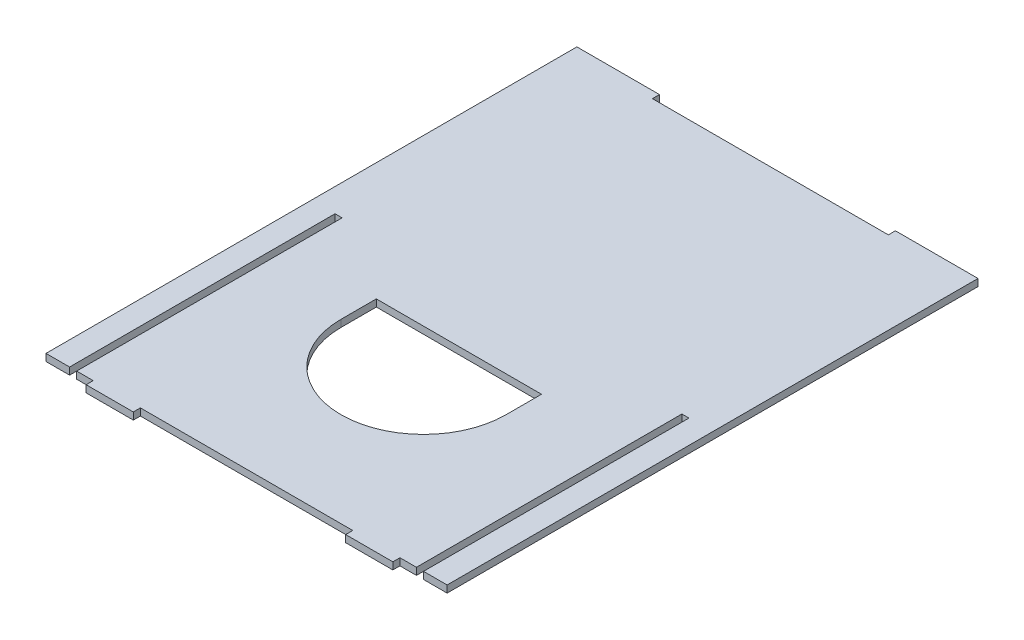
ISO-10303-21;
HEADER;
FILE_DESCRIPTION(('STEP AP214'),'2;1');
FILE_NAME('part.step','',(''),(''),'','','');
FILE_SCHEMA(('AUTOMOTIVE_DESIGN { 1 0 10303 214 1 1 1 1 }'));
ENDSEC;
DATA;
#1=APPLICATION_CONTEXT('core data for automotive mechanical design processes');
#2=APPLICATION_PROTOCOL_DEFINITION('international standard','automotive_design',2000,#1);
#3=PRODUCT_CONTEXT('',#1,'mechanical');
#4=PRODUCT('Part','Part','',(#3));
#5=PRODUCT_RELATED_PRODUCT_CATEGORY('part','',(#4));
#6=PRODUCT_DEFINITION_FORMATION('','',#4);
#7=PRODUCT_DEFINITION_CONTEXT('part definition',#1,'design');
#8=PRODUCT_DEFINITION('design','',#6,#7);
#9=PRODUCT_DEFINITION_SHAPE('','',#8);
#10=(LENGTH_UNIT() NAMED_UNIT(*) SI_UNIT(.MILLI.,.METRE.));
#11=(NAMED_UNIT(*) PLANE_ANGLE_UNIT() SI_UNIT($,.RADIAN.));
#12=(NAMED_UNIT(*) SI_UNIT($,.STERADIAN.) SOLID_ANGLE_UNIT());
#13=UNCERTAINTY_MEASURE_WITH_UNIT(LENGTH_MEASURE(1.E-05),#10,'distance_accuracy_value','');
#14=(GEOMETRIC_REPRESENTATION_CONTEXT(3) GLOBAL_UNCERTAINTY_ASSIGNED_CONTEXT((#13)) GLOBAL_UNIT_ASSIGNED_CONTEXT((#10,
#11,#12)) REPRESENTATION_CONTEXT('',''));
#15=CARTESIAN_POINT('',(0.,0.,0.));
#16=DIRECTION('',(0.,0.,1.));
#17=DIRECTION('',(1.,0.,0.));
#18=AXIS2_PLACEMENT_3D('',#15,#16,#17);
#19=CARTESIAN_POINT('',(0.,6.,-450.));
#20=DIRECTION('',(0.,0.,1.));
#21=DIRECTION('',(1.,0.,0.));
#22=AXIS2_PLACEMENT_3D('',#19,#20,#21);
#23=PLANE('',#22);
#24=DIRECTION('',(-1.,0.,0.));
#25=VECTOR('',#24,1.);
#26=CARTESIAN_POINT('',(0.,6.,-450.));
#27=LINE('',#26,#25);
#28=CARTESIAN_POINT('',(70.,6.,-450.));
#29=VERTEX_POINT('',#28);
#30=CARTESIAN_POINT('',(0.,6.,-450.));
#31=VERTEX_POINT('',#30);
#32=EDGE_CURVE('E365',#29,#31,#27,.T.);
#33=ORIENTED_EDGE('',*,*,#32,.F.);
#34=DIRECTION('',(0.,1.,0.));
#35=VECTOR('',#34,1.);
#36=CARTESIAN_POINT('',(70.,0.,-450.));
#37=LINE('',#36,#35);
#38=CARTESIAN_POINT('',(70.,0.,-450.));
#39=VERTEX_POINT('',#38);
#40=EDGE_CURVE('E272',#39,#29,#37,.T.);
#41=ORIENTED_EDGE('',*,*,#40,.F.);
#42=DIRECTION('',(-1.,0.,0.));
#43=VECTOR('',#42,1.);
#44=CARTESIAN_POINT('',(0.,0.,-450.));
#45=LINE('',#44,#43);
#46=CARTESIAN_POINT('',(0.,0.,-450.));
#47=VERTEX_POINT('',#46);
#48=EDGE_CURVE('E395',#39,#47,#45,.T.);
#49=ORIENTED_EDGE('',*,*,#48,.T.);
#50=DIRECTION('',(0.,-1.,0.));
#51=VECTOR('',#50,1.);
#52=CARTESIAN_POINT('',(0.,6.,-450.));
#53=LINE('',#52,#51);
#54=EDGE_CURVE('E403',#31,#47,#53,.T.);
#55=ORIENTED_EDGE('',*,*,#54,.F.);
#56=EDGE_LOOP('',(#33,#41,#49,#55));
#57=FACE_BOUND('',#56,.T.);
#58=ADVANCED_FACE('F41',(#57),#23,.F.);
#59=CARTESIAN_POINT('',(300.,6.,-2.10463319099841E-13));
#60=DIRECTION('',(0.,0.,-1.));
#61=DIRECTION('',(-1.,0.,0.));
#62=AXIS2_PLACEMENT_3D('',#59,#60,#61);
#63=PLANE('',#62);
#64=DIRECTION('',(1.,0.,0.));
#65=VECTOR('',#64,1.);
#66=CARTESIAN_POINT('',(300.,0.,-2.10463319099841E-13));
#67=LINE('',#66,#65);
#68=CARTESIAN_POINT('',(300.,0.,-2.10463319099841E-13));
#69=VERTEX_POINT('',#68);
#70=CARTESIAN_POINT('',(314.,0.,-3.31505656259168E-13));
#71=VERTEX_POINT('',#70);
#72=EDGE_CURVE('E390',#69,#71,#67,.T.);
#73=ORIENTED_EDGE('',*,*,#72,.T.);
#74=DIRECTION('',(0.,1.,0.));
#75=VECTOR('',#74,1.);
#76=CARTESIAN_POINT('',(314.,0.,-3.31505656259168E-13));
#77=LINE('',#76,#75);
#78=CARTESIAN_POINT('',(314.,6.,-3.31505656259168E-13));
#79=VERTEX_POINT('',#78);
#80=EDGE_CURVE('E299',#71,#79,#77,.T.);
#81=ORIENTED_EDGE('',*,*,#80,.T.);
#82=DIRECTION('',(1.,0.,0.));
#83=VECTOR('',#82,1.);
#84=CARTESIAN_POINT('',(300.,6.,-2.10463319099841E-13));
#85=LINE('',#84,#83);
#86=CARTESIAN_POINT('',(300.,6.,-2.10463319099841E-13));
#87=VERTEX_POINT('',#86);
#88=EDGE_CURVE('E360',#87,#79,#85,.T.);
#89=ORIENTED_EDGE('',*,*,#88,.F.);
#90=DIRECTION('',(0.,-1.,0.));
#91=VECTOR('',#90,1.);
#92=CARTESIAN_POINT('',(300.,6.,-2.10463319099841E-13));
#93=LINE('',#92,#91);
#94=EDGE_CURVE('E412',#87,#69,#93,.T.);
#95=ORIENTED_EDGE('',*,*,#94,.T.);
#96=EDGE_LOOP('',(#73,#81,#89,#95));
#97=FACE_BOUND('',#96,.T.);
#98=ADVANCED_FACE('F523',(#97),#63,.F.);
#99=CARTESIAN_POINT('',(40.,6.,0.));
#100=DIRECTION('',(0.,0.,-1.));
#101=DIRECTION('',(-1.,0.,0.));
#102=AXIS2_PLACEMENT_3D('',#99,#100,#101);
#103=PLANE('',#102);
#104=DIRECTION('',(1.,0.,0.));
#105=VECTOR('',#104,1.);
#106=CARTESIAN_POINT('',(40.,0.,0.));
#107=LINE('',#106,#105);
#108=CARTESIAN_POINT('',(0.,0.,0.));
#109=VERTEX_POINT('',#108);
#110=CARTESIAN_POINT('',(20.,0.,0.));
#111=VERTEX_POINT('',#110);
#112=EDGE_CURVE('E372',#109,#111,#107,.T.);
#113=ORIENTED_EDGE('',*,*,#112,.T.);
#114=DIRECTION('',(0.,1.,0.));
#115=VECTOR('',#114,1.);
#116=CARTESIAN_POINT('',(20.,0.,0.));
#117=LINE('',#116,#115);
#118=CARTESIAN_POINT('',(20.,6.,0.));
#119=VERTEX_POINT('',#118);
#120=EDGE_CURVE('E325',#111,#119,#117,.T.);
#121=ORIENTED_EDGE('',*,*,#120,.T.);
#122=DIRECTION('',(1.,0.,0.));
#123=VECTOR('',#122,1.);
#124=CARTESIAN_POINT('',(40.,6.,0.));
#125=LINE('',#124,#123);
#126=CARTESIAN_POINT('',(0.,6.,0.));
#127=VERTEX_POINT('',#126);
#128=EDGE_CURVE('E341',#127,#119,#125,.T.);
#129=ORIENTED_EDGE('',*,*,#128,.F.);
#130=DIRECTION('',(0.,-1.,0.));
#131=VECTOR('',#130,1.);
#132=CARTESIAN_POINT('',(0.,6.,0.));
#133=LINE('',#132,#131);
#134=EDGE_CURVE('E371',#127,#109,#133,.T.);
#135=ORIENTED_EDGE('',*,*,#134,.T.);
#136=EDGE_LOOP('',(#113,#121,#129,#135));
#137=FACE_BOUND('',#136,.T.);
#138=ADVANCED_FACE('F475',(#137),#103,.F.);
#139=CARTESIAN_POINT('',(26.,6.,0.));
#140=VERTEX_POINT('',#139);
#141=CARTESIAN_POINT('',(40.,6.,0.));
#142=VERTEX_POINT('',#141);
#143=EDGE_CURVE('E345',#140,#142,#125,.T.);
#144=ORIENTED_EDGE('',*,*,#143,.F.);
#145=DIRECTION('',(0.,1.,0.));
#146=VECTOR('',#145,1.);
#147=CARTESIAN_POINT('',(26.,0.,0.));
#148=LINE('',#147,#146);
#149=CARTESIAN_POINT('',(26.,0.,0.));
#150=VERTEX_POINT('',#149);
#151=EDGE_CURVE('E337',#150,#140,#148,.T.);
#152=ORIENTED_EDGE('',*,*,#151,.F.);
#153=CARTESIAN_POINT('',(40.,0.,0.));
#154=VERTEX_POINT('',#153);
#155=EDGE_CURVE('E334',#150,#154,#107,.T.);
#156=ORIENTED_EDGE('',*,*,#155,.T.);
#157=DIRECTION('',(0.,-1.,0.));
#158=VECTOR('',#157,1.);
#159=CARTESIAN_POINT('',(40.,6.,0.));
#160=LINE('',#159,#158);
#161=EDGE_CURVE('E11',#142,#154,#160,.T.);
#162=ORIENTED_EDGE('',*,*,#161,.F.);
#163=EDGE_LOOP('',(#144,#152,#156,#162));
#164=FACE_BOUND('',#163,.T.);
#165=ADVANCED_FACE('F43',(#164),#103,.F.);
#166=CARTESIAN_POINT('',(40.,6.,0.));
#167=DIRECTION('',(1.,0.,0.));
#168=DIRECTION('',(0.,0.,-1.));
#169=AXIS2_PLACEMENT_3D('',#166,#167,#168);
#170=PLANE('',#169);
#171=DIRECTION('',(0.,0.,1.));
#172=VECTOR('',#171,1.);
#173=CARTESIAN_POINT('',(40.,0.,0.));
#174=LINE('',#173,#172);
#175=CARTESIAN_POINT('',(40.,0.,6.00000000000003));
#176=VERTEX_POINT('',#175);
#177=EDGE_CURVE('E375',#154,#176,#174,.T.);
#178=ORIENTED_EDGE('',*,*,#177,.T.);
#179=DIRECTION('',(0.,-1.,0.));
#180=VECTOR('',#179,1.);
#181=CARTESIAN_POINT('',(40.,6.,6.00000000000003));
#182=LINE('',#181,#180);
#183=CARTESIAN_POINT('',(40.,6.,6.00000000000003));
#184=VERTEX_POINT('',#183);
#185=EDGE_CURVE('E49',#184,#176,#182,.T.);
#186=ORIENTED_EDGE('',*,*,#185,.F.);
#187=DIRECTION('',(0.,0.,1.));
#188=VECTOR('',#187,1.);
#189=CARTESIAN_POINT('',(40.,6.,0.));
#190=LINE('',#189,#188);
#191=EDGE_CURVE('E344',#142,#184,#190,.T.);
#192=ORIENTED_EDGE('',*,*,#191,.F.);
#193=ORIENTED_EDGE('',*,*,#161,.T.);
#194=EDGE_LOOP('',(#178,#186,#192,#193));
#195=FACE_BOUND('',#194,.T.);
#196=ADVANCED_FACE('F459',(#195),#170,.F.);
#197=CARTESIAN_POINT('',(40.,6.,6.00000000000003));
#198=DIRECTION('',(0.,0.,-1.));
#199=DIRECTION('',(-1.,0.,0.));
#200=AXIS2_PLACEMENT_3D('',#197,#198,#199);
#201=PLANE('',#200);
#202=DIRECTION('',(1.,0.,0.));
#203=VECTOR('',#202,1.);
#204=CARTESIAN_POINT('',(40.,0.,6.00000000000003));
#205=LINE('',#204,#203);
#206=CARTESIAN_POINT('',(80.,0.,5.99999999999993));
#207=VERTEX_POINT('',#206);
#208=EDGE_CURVE('E377',#176,#207,#205,.T.);
#209=ORIENTED_EDGE('',*,*,#208,.T.);
#210=DIRECTION('',(0.,-1.,0.));
#211=VECTOR('',#210,1.);
#212=CARTESIAN_POINT('',(80.,6.,5.99999999999993));
#213=LINE('',#212,#211);
#214=CARTESIAN_POINT('',(80.,6.,5.99999999999993));
#215=VERTEX_POINT('',#214);
#216=EDGE_CURVE('E427',#215,#207,#213,.T.);
#217=ORIENTED_EDGE('',*,*,#216,.F.);
#218=DIRECTION('',(1.,0.,0.));
#219=VECTOR('',#218,1.);
#220=CARTESIAN_POINT('',(40.,6.,6.00000000000003));
#221=LINE('',#220,#219);
#222=EDGE_CURVE('E347',#184,#215,#221,.T.);
#223=ORIENTED_EDGE('',*,*,#222,.F.);
#224=ORIENTED_EDGE('',*,*,#185,.T.);
#225=EDGE_LOOP('',(#209,#217,#223,#224));
#226=FACE_BOUND('',#225,.T.);
#227=ADVANCED_FACE('F434',(#226),#201,.F.);
#228=CARTESIAN_POINT('',(80.,6.,5.99999999999993));
#229=DIRECTION('',(-1.,0.,0.));
#230=DIRECTION('',(0.,0.,1.));
#231=AXIS2_PLACEMENT_3D('',#228,#229,#230);
#232=PLANE('',#231);
#233=DIRECTION('',(0.,0.,-1.));
#234=VECTOR('',#233,1.);
#235=CARTESIAN_POINT('',(80.,0.,5.99999999999993));
#236=LINE('',#235,#234);
#237=CARTESIAN_POINT('',(80.,0.,0.));
#238=VERTEX_POINT('',#237);
#239=EDGE_CURVE('E379',#207,#238,#236,.T.);
#240=ORIENTED_EDGE('',*,*,#239,.T.);
#241=DIRECTION('',(0.,-1.,0.));
#242=VECTOR('',#241,1.);
#243=CARTESIAN_POINT('',(80.,6.,0.));
#244=LINE('',#243,#242);
#245=CARTESIAN_POINT('',(80.,6.,0.));
#246=VERTEX_POINT('',#245);
#247=EDGE_CURVE('E424',#246,#238,#244,.T.);
#248=ORIENTED_EDGE('',*,*,#247,.F.);
#249=DIRECTION('',(0.,0.,-1.));
#250=VECTOR('',#249,1.);
#251=CARTESIAN_POINT('',(80.,6.,5.99999999999993));
#252=LINE('',#251,#250);
#253=EDGE_CURVE('E349',#215,#246,#252,.T.);
#254=ORIENTED_EDGE('',*,*,#253,.F.);
#255=ORIENTED_EDGE('',*,*,#216,.T.);
#256=EDGE_LOOP('',(#240,#248,#254,#255));
#257=FACE_BOUND('',#256,.T.);
#258=ADVANCED_FACE('F445',(#257),#232,.F.);
#259=CARTESIAN_POINT('',(80.,6.,0.));
#260=DIRECTION('',(0.,0.,-1.));
#261=DIRECTION('',(-1.,0.,0.));
#262=AXIS2_PLACEMENT_3D('',#259,#260,#261);
#263=PLANE('',#262);
#264=DIRECTION('',(1.,0.,0.));
#265=VECTOR('',#264,1.);
#266=CARTESIAN_POINT('',(80.,0.,0.));
#267=LINE('',#266,#265);
#268=CARTESIAN_POINT('',(260.,0.,-1.85615411929518E-13));
#269=VERTEX_POINT('',#268);
#270=EDGE_CURVE('E381',#238,#269,#267,.T.);
#271=ORIENTED_EDGE('',*,*,#270,.T.);
#272=DIRECTION('',(0.,-1.,0.));
#273=VECTOR('',#272,1.);
#274=CARTESIAN_POINT('',(260.,6.,-1.85615411929518E-13));
#275=LINE('',#274,#273);
#276=CARTESIAN_POINT('',(260.,6.,-1.85615411929518E-13));
#277=VERTEX_POINT('',#276);
#278=EDGE_CURVE('E421',#277,#269,#275,.T.);
#279=ORIENTED_EDGE('',*,*,#278,.F.);
#280=DIRECTION('',(1.,0.,0.));
#281=VECTOR('',#280,1.);
#282=CARTESIAN_POINT('',(80.,6.,0.));
#283=LINE('',#282,#281);
#284=EDGE_CURVE('E351',#246,#277,#283,.T.);
#285=ORIENTED_EDGE('',*,*,#284,.F.);
#286=ORIENTED_EDGE('',*,*,#247,.T.);
#287=EDGE_LOOP('',(#271,#279,#285,#286));
#288=FACE_BOUND('',#287,.T.);
#289=ADVANCED_FACE('F449',(#288),#263,.F.);
#290=CARTESIAN_POINT('',(260.,6.,5.99999999999979));
#291=DIRECTION('',(1.,0.,0.));
#292=DIRECTION('',(0.,0.,-1.));
#293=AXIS2_PLACEMENT_3D('',#290,#291,#292);
#294=PLANE('',#293);
#295=DIRECTION('',(0.,0.,1.));
#296=VECTOR('',#295,1.);
#297=CARTESIAN_POINT('',(260.,0.,5.99999999999979));
#298=LINE('',#297,#296);
#299=CARTESIAN_POINT('',(260.,0.,5.99999999999979));
#300=VERTEX_POINT('',#299);
#301=EDGE_CURVE('E383',#269,#300,#298,.T.);
#302=ORIENTED_EDGE('',*,*,#301,.T.);
#303=DIRECTION('',(0.,-1.,0.));
#304=VECTOR('',#303,1.);
#305=CARTESIAN_POINT('',(260.,6.,5.99999999999979));
#306=LINE('',#305,#304);
#307=CARTESIAN_POINT('',(260.,6.,5.99999999999979));
#308=VERTEX_POINT('',#307);
#309=EDGE_CURVE('E418',#308,#300,#306,.T.);
#310=ORIENTED_EDGE('',*,*,#309,.F.);
#311=DIRECTION('',(0.,0.,1.));
#312=VECTOR('',#311,1.);
#313=CARTESIAN_POINT('',(260.,6.,5.99999999999979));
#314=LINE('',#313,#312);
#315=EDGE_CURVE('E353',#277,#308,#314,.T.);
#316=ORIENTED_EDGE('',*,*,#315,.F.);
#317=ORIENTED_EDGE('',*,*,#278,.T.);
#318=EDGE_LOOP('',(#302,#310,#316,#317));
#319=FACE_BOUND('',#318,.T.);
#320=ADVANCED_FACE('F535',(#319),#294,.F.);
#321=CARTESIAN_POINT('',(300.,6.,5.99999999999979));
#322=DIRECTION('',(0.,0.,-1.));
#323=DIRECTION('',(-1.,0.,0.));
#324=AXIS2_PLACEMENT_3D('',#321,#322,#323);
#325=PLANE('',#324);
#326=DIRECTION('',(1.,0.,0.));
#327=VECTOR('',#326,1.);
#328=CARTESIAN_POINT('',(300.,0.,5.99999999999979));
#329=LINE('',#328,#327);
#330=CARTESIAN_POINT('',(300.,0.,5.99999999999979));
#331=VERTEX_POINT('',#330);
#332=EDGE_CURVE('E385',#300,#331,#329,.T.);
#333=ORIENTED_EDGE('',*,*,#332,.T.);
#334=DIRECTION('',(0.,-1.,0.));
#335=VECTOR('',#334,1.);
#336=CARTESIAN_POINT('',(300.,6.,5.99999999999979));
#337=LINE('',#336,#335);
#338=CARTESIAN_POINT('',(300.,6.,5.99999999999979));
#339=VERTEX_POINT('',#338);
#340=EDGE_CURVE('E415',#339,#331,#337,.T.);
#341=ORIENTED_EDGE('',*,*,#340,.F.);
#342=DIRECTION('',(1.,0.,0.));
#343=VECTOR('',#342,1.);
#344=CARTESIAN_POINT('',(300.,6.,5.99999999999979));
#345=LINE('',#344,#343);
#346=EDGE_CURVE('E355',#308,#339,#345,.T.);
#347=ORIENTED_EDGE('',*,*,#346,.F.);
#348=ORIENTED_EDGE('',*,*,#309,.T.);
#349=EDGE_LOOP('',(#333,#341,#347,#348));
#350=FACE_BOUND('',#349,.T.);
#351=ADVANCED_FACE('F532',(#350),#325,.F.);
#352=CARTESIAN_POINT('',(300.,6.,-2.10463319099841E-13));
#353=DIRECTION('',(-1.,0.,0.));
#354=DIRECTION('',(0.,0.,1.));
#355=AXIS2_PLACEMENT_3D('',#352,#353,#354);
#356=PLANE('',#355);
#357=DIRECTION('',(0.,0.,-1.));
#358=VECTOR('',#357,1.);
#359=CARTESIAN_POINT('',(300.,0.,-2.10463319099841E-13));
#360=LINE('',#359,#358);
#361=EDGE_CURVE('E387',#331,#69,#360,.T.);
#362=ORIENTED_EDGE('',*,*,#361,.T.);
#363=ORIENTED_EDGE('',*,*,#94,.F.);
#364=DIRECTION('',(0.,0.,-1.));
#365=VECTOR('',#364,1.);
#366=CARTESIAN_POINT('',(300.,6.,-2.10463319099841E-13));
#367=LINE('',#366,#365);
#368=EDGE_CURVE('E357',#339,#87,#367,.T.);
#369=ORIENTED_EDGE('',*,*,#368,.F.);
#370=ORIENTED_EDGE('',*,*,#340,.T.);
#371=EDGE_LOOP('',(#362,#363,#369,#370));
#372=FACE_BOUND('',#371,.T.);
#373=ADVANCED_FACE('F528',(#372),#356,.F.);
#374=CARTESIAN_POINT('',(320.,6.,-3.31505656259168E-13));
#375=VERTEX_POINT('',#374);
#376=CARTESIAN_POINT('',(340.,6.,0.));
#377=VERTEX_POINT('',#376);
#378=EDGE_CURVE('E359',#375,#377,#85,.T.);
#379=ORIENTED_EDGE('',*,*,#378,.F.);
#380=DIRECTION('',(0.,1.,0.));
#381=VECTOR('',#380,1.);
#382=CARTESIAN_POINT('',(320.,0.,-3.31505656259168E-13));
#383=LINE('',#382,#381);
#384=CARTESIAN_POINT('',(320.,0.,-3.31505656259168E-13));
#385=VERTEX_POINT('',#384);
#386=EDGE_CURVE('E311',#385,#375,#383,.T.);
#387=ORIENTED_EDGE('',*,*,#386,.F.);
#388=CARTESIAN_POINT('',(340.,0.,0.));
#389=VERTEX_POINT('',#388);
#390=EDGE_CURVE('E389',#385,#389,#67,.T.);
#391=ORIENTED_EDGE('',*,*,#390,.T.);
#392=DIRECTION('',(0.,-1.,0.));
#393=VECTOR('',#392,1.);
#394=CARTESIAN_POINT('',(340.,6.,0.));
#395=LINE('',#394,#393);
#396=EDGE_CURVE('E409',#377,#389,#395,.T.);
#397=ORIENTED_EDGE('',*,*,#396,.F.);
#398=EDGE_LOOP('',(#379,#387,#391,#397));
#399=FACE_BOUND('',#398,.T.);
#400=ADVANCED_FACE('F509',(#399),#63,.F.);
#401=CARTESIAN_POINT('',(340.,6.,0.));
#402=DIRECTION('',(-1.,0.,0.));
#403=DIRECTION('',(0.,0.,1.));
#404=AXIS2_PLACEMENT_3D('',#401,#402,#403);
#405=PLANE('',#404);
#406=DIRECTION('',(0.,0.,-1.));
#407=VECTOR('',#406,1.);
#408=CARTESIAN_POINT('',(340.,0.,0.));
#409=LINE('',#408,#407);
#410=CARTESIAN_POINT('',(340.,0.,-450.));
#411=VERTEX_POINT('',#410);
#412=EDGE_CURVE('E393',#389,#411,#409,.T.);
#413=ORIENTED_EDGE('',*,*,#412,.T.);
#414=DIRECTION('',(0.,-1.,0.));
#415=VECTOR('',#414,1.);
#416=CARTESIAN_POINT('',(340.,6.,-450.));
#417=LINE('',#416,#415);
#418=CARTESIAN_POINT('',(340.,6.,-450.));
#419=VERTEX_POINT('',#418);
#420=EDGE_CURVE('E406',#419,#411,#417,.T.);
#421=ORIENTED_EDGE('',*,*,#420,.F.);
#422=DIRECTION('',(0.,0.,-1.));
#423=VECTOR('',#422,1.);
#424=CARTESIAN_POINT('',(340.,6.,0.));
#425=LINE('',#424,#423);
#426=EDGE_CURVE('E363',#377,#419,#425,.T.);
#427=ORIENTED_EDGE('',*,*,#426,.F.);
#428=ORIENTED_EDGE('',*,*,#396,.T.);
#429=EDGE_LOOP('',(#413,#421,#427,#428));
#430=FACE_BOUND('',#429,.T.);
#431=ADVANCED_FACE('F503',(#430),#405,.F.);
#432=CARTESIAN_POINT('',(270.,0.,-450.));
#433=VERTEX_POINT('',#432);
#434=EDGE_CURVE('E396',#411,#433,#45,.T.);
#435=ORIENTED_EDGE('',*,*,#434,.T.);
#436=DIRECTION('',(0.,1.,0.));
#437=VECTOR('',#436,1.);
#438=CARTESIAN_POINT('',(270.,0.,-450.));
#439=LINE('',#438,#437);
#440=CARTESIAN_POINT('',(270.,6.,-450.));
#441=VERTEX_POINT('',#440);
#442=EDGE_CURVE('E269',#433,#441,#439,.T.);
#443=ORIENTED_EDGE('',*,*,#442,.T.);
#444=EDGE_CURVE('E366',#419,#441,#27,.T.);
#445=ORIENTED_EDGE('',*,*,#444,.F.);
#446=ORIENTED_EDGE('',*,*,#420,.T.);
#447=EDGE_LOOP('',(#435,#443,#445,#446));
#448=FACE_BOUND('',#447,.T.);
#449=ADVANCED_FACE('F498',(#448),#23,.F.);
#450=CARTESIAN_POINT('',(0.,6.,0.));
#451=DIRECTION('',(1.,0.,0.));
#452=DIRECTION('',(0.,0.,-1.));
#453=AXIS2_PLACEMENT_3D('',#450,#451,#452);
#454=PLANE('',#453);
#455=DIRECTION('',(0.,0.,1.));
#456=VECTOR('',#455,1.);
#457=CARTESIAN_POINT('',(0.,0.,0.));
#458=LINE('',#457,#456);
#459=EDGE_CURVE('E399',#47,#109,#458,.T.);
#460=ORIENTED_EDGE('',*,*,#459,.T.);
#461=ORIENTED_EDGE('',*,*,#134,.F.);
#462=DIRECTION('',(0.,0.,1.));
#463=VECTOR('',#462,1.);
#464=CARTESIAN_POINT('',(0.,6.,0.));
#465=LINE('',#464,#463);
#466=EDGE_CURVE('E369',#31,#127,#465,.T.);
#467=ORIENTED_EDGE('',*,*,#466,.F.);
#468=ORIENTED_EDGE('',*,*,#54,.T.);
#469=EDGE_LOOP('',(#460,#461,#467,#468));
#470=FACE_BOUND('',#469,.T.);
#471=ADVANCED_FACE('F480',(#470),#454,.F.);
#472=CARTESIAN_POINT('',(0.,6.,0.));
#473=DIRECTION('',(0.,-1.,0.));
#474=DIRECTION('',(0.,0.,-1.));
#475=AXIS2_PLACEMENT_3D('',#472,#473,#474);
#476=PLANE('',#475);
#477=DIRECTION('',(0.,0.,1.));
#478=VECTOR('',#477,1.);
#479=CARTESIAN_POINT('',(100.,6.,-150.));
#480=LINE('',#479,#478);
#481=CARTESIAN_POINT('',(100.,6.,-180.));
#482=VERTEX_POINT('',#481);
#483=CARTESIAN_POINT('',(100.,6.,-150.));
#484=VERTEX_POINT('',#483);
#485=EDGE_CURVE('E253',#482,#484,#480,.T.);
#486=ORIENTED_EDGE('',*,*,#485,.F.);
#487=DIRECTION('',(-1.,0.,0.));
#488=VECTOR('',#487,1.);
#489=CARTESIAN_POINT('',(100.,6.,-180.));
#490=LINE('',#489,#488);
#491=CARTESIAN_POINT('',(240.,6.,-180.));
#492=VERTEX_POINT('',#491);
#493=EDGE_CURVE('E56',#492,#482,#490,.T.);
#494=ORIENTED_EDGE('',*,*,#493,.F.);
#495=DIRECTION('',(0.,0.,-1.));
#496=VECTOR('',#495,1.);
#497=CARTESIAN_POINT('',(240.,6.,-150.));
#498=LINE('',#497,#496);
#499=CARTESIAN_POINT('',(240.,6.,-150.));
#500=VERTEX_POINT('',#499);
#501=EDGE_CURVE('E244',#500,#492,#498,.T.);
#502=ORIENTED_EDGE('',*,*,#501,.F.);
#503=CARTESIAN_POINT('',(170.,6.,-150.));
#504=DIRECTION('',(0.,1.,0.));
#505=DIRECTION('',(0.,0.,1.));
#506=AXIS2_PLACEMENT_3D('',#503,#504,#505);
#507=CIRCLE('',#506,70.);
#508=EDGE_CURVE('E247',#484,#500,#507,.T.);
#509=ORIENTED_EDGE('',*,*,#508,.F.);
#510=EDGE_LOOP('',(#486,#494,#502,#509));
#511=FACE_BOUND('',#510,.T.);
#512=DIRECTION('',(1.,0.,0.));
#513=VECTOR('',#512,1.);
#514=CARTESIAN_POINT('',(70.,6.,-444.));
#515=LINE('',#514,#513);
#516=CARTESIAN_POINT('',(70.,6.,-444.));
#517=VERTEX_POINT('',#516);
#518=CARTESIAN_POINT('',(270.,6.,-444.));
#519=VERTEX_POINT('',#518);
#520=EDGE_CURVE('E276',#517,#519,#515,.T.);
#521=ORIENTED_EDGE('',*,*,#520,.F.);
#522=DIRECTION('',(0.,0.,1.));
#523=VECTOR('',#522,1.);
#524=CARTESIAN_POINT('',(70.,6.,-450.));
#525=LINE('',#524,#523);
#526=EDGE_CURVE('E254',#29,#517,#525,.T.);
#527=ORIENTED_EDGE('',*,*,#526,.F.);
#528=ORIENTED_EDGE('',*,*,#32,.T.);
#529=ORIENTED_EDGE('',*,*,#466,.T.);
#530=ORIENTED_EDGE('',*,*,#128,.T.);
#531=DIRECTION('',(0.,0.,1.));
#532=VECTOR('',#531,1.);
#533=CARTESIAN_POINT('',(20.,6.,0.));
#534=LINE('',#533,#532);
#535=CARTESIAN_POINT('',(20.,6.,-225.));
#536=VERTEX_POINT('',#535);
#537=EDGE_CURVE('E308',#536,#119,#534,.T.);
#538=ORIENTED_EDGE('',*,*,#537,.F.);
#539=DIRECTION('',(-1.,0.,0.));
#540=VECTOR('',#539,1.);
#541=CARTESIAN_POINT('',(20.,6.,-225.));
#542=LINE('',#541,#540);
#543=CARTESIAN_POINT('',(26.,6.,-225.));
#544=VERTEX_POINT('',#543);
#545=EDGE_CURVE('E319',#544,#536,#542,.T.);
#546=ORIENTED_EDGE('',*,*,#545,.F.);
#547=DIRECTION('',(0.,0.,-1.));
#548=VECTOR('',#547,1.);
#549=CARTESIAN_POINT('',(26.,6.,0.));
#550=LINE('',#549,#548);
#551=EDGE_CURVE('E327',#140,#544,#550,.T.);
#552=ORIENTED_EDGE('',*,*,#551,.F.);
#553=ORIENTED_EDGE('',*,*,#143,.T.);
#554=ORIENTED_EDGE('',*,*,#191,.T.);
#555=ORIENTED_EDGE('',*,*,#222,.T.);
#556=ORIENTED_EDGE('',*,*,#253,.T.);
#557=ORIENTED_EDGE('',*,*,#284,.T.);
#558=ORIENTED_EDGE('',*,*,#315,.T.);
#559=ORIENTED_EDGE('',*,*,#346,.T.);
#560=ORIENTED_EDGE('',*,*,#368,.T.);
#561=ORIENTED_EDGE('',*,*,#88,.T.);
#562=DIRECTION('',(0.,0.,1.));
#563=VECTOR('',#562,1.);
#564=CARTESIAN_POINT('',(314.,6.,-3.31505656259168E-13));
#565=LINE('',#564,#563);
#566=CARTESIAN_POINT('',(314.,6.,-225.));
#567=VERTEX_POINT('',#566);
#568=EDGE_CURVE('E260',#567,#79,#565,.T.);
#569=ORIENTED_EDGE('',*,*,#568,.F.);
#570=DIRECTION('',(-1.,0.,0.));
#571=VECTOR('',#570,1.);
#572=CARTESIAN_POINT('',(314.,6.,-225.));
#573=LINE('',#572,#571);
#574=CARTESIAN_POINT('',(320.,6.,-225.));
#575=VERTEX_POINT('',#574);
#576=EDGE_CURVE('E293',#575,#567,#573,.T.);
#577=ORIENTED_EDGE('',*,*,#576,.F.);
#578=DIRECTION('',(0.,0.,-1.));
#579=VECTOR('',#578,1.);
#580=CARTESIAN_POINT('',(320.,6.,-3.31505656259168E-13));
#581=LINE('',#580,#579);
#582=EDGE_CURVE('E301',#375,#575,#581,.T.);
#583=ORIENTED_EDGE('',*,*,#582,.F.);
#584=ORIENTED_EDGE('',*,*,#378,.T.);
#585=ORIENTED_EDGE('',*,*,#426,.T.);
#586=ORIENTED_EDGE('',*,*,#444,.T.);
#587=DIRECTION('',(0.,0.,-1.));
#588=VECTOR('',#587,1.);
#589=CARTESIAN_POINT('',(270.,6.,-450.));
#590=LINE('',#589,#588);
#591=EDGE_CURVE('E274',#519,#441,#590,.T.);
#592=ORIENTED_EDGE('',*,*,#591,.F.);
#593=EDGE_LOOP('',(#521,#527,#528,#529,#530,#538,#546,#552,#553,#554,#555,#556,#557,#558,#559,
#560,#561,#569,#577,#583,#584,#585,#586,#592));
#594=FACE_BOUND('',#593,.T.);
#595=ADVANCED_FACE('F454',(#511,#594),#476,.F.);
#596=CARTESIAN_POINT('',(0.,0.,0.));
#597=DIRECTION('',(0.,-1.,0.));
#598=DIRECTION('',(0.,0.,-1.));
#599=AXIS2_PLACEMENT_3D('',#596,#597,#598);
#600=PLANE('',#599);
#601=DIRECTION('',(-1.,0.,0.));
#602=VECTOR('',#601,1.);
#603=CARTESIAN_POINT('',(100.,0.,-180.));
#604=LINE('',#603,#602);
#605=CARTESIAN_POINT('',(240.,0.,-180.));
#606=VERTEX_POINT('',#605);
#607=CARTESIAN_POINT('',(100.,0.,-180.));
#608=VERTEX_POINT('',#607);
#609=EDGE_CURVE('E228',#606,#608,#604,.T.);
#610=ORIENTED_EDGE('',*,*,#609,.T.);
#611=DIRECTION('',(0.,0.,1.));
#612=VECTOR('',#611,1.);
#613=CARTESIAN_POINT('',(100.,0.,-150.));
#614=LINE('',#613,#612);
#615=CARTESIAN_POINT('',(100.,0.,-150.));
#616=VERTEX_POINT('',#615);
#617=EDGE_CURVE('E237',#608,#616,#614,.T.);
#618=ORIENTED_EDGE('',*,*,#617,.T.);
#619=CARTESIAN_POINT('',(170.,0.,-150.));
#620=DIRECTION('',(0.,1.,0.));
#621=DIRECTION('',(0.,0.,1.));
#622=AXIS2_PLACEMENT_3D('',#619,#620,#621);
#623=CIRCLE('',#622,70.);
#624=CARTESIAN_POINT('',(240.,0.,-150.));
#625=VERTEX_POINT('',#624);
#626=EDGE_CURVE('E64',#616,#625,#623,.T.);
#627=ORIENTED_EDGE('',*,*,#626,.T.);
#628=DIRECTION('',(0.,0.,-1.));
#629=VECTOR('',#628,1.);
#630=CARTESIAN_POINT('',(240.,0.,-150.));
#631=LINE('',#630,#629);
#632=EDGE_CURVE('E234',#625,#606,#631,.T.);
#633=ORIENTED_EDGE('',*,*,#632,.T.);
#634=EDGE_LOOP('',(#610,#618,#627,#633));
#635=FACE_BOUND('',#634,.T.);
#636=DIRECTION('',(0.,0.,1.));
#637=VECTOR('',#636,1.);
#638=CARTESIAN_POINT('',(70.,0.,-450.));
#639=LINE('',#638,#637);
#640=CARTESIAN_POINT('',(70.,0.,-444.));
#641=VERTEX_POINT('',#640);
#642=EDGE_CURVE('E277',#39,#641,#639,.T.);
#643=ORIENTED_EDGE('',*,*,#642,.T.);
#644=DIRECTION('',(1.,0.,0.));
#645=VECTOR('',#644,1.);
#646=CARTESIAN_POINT('',(70.,0.,-444.));
#647=LINE('',#646,#645);
#648=CARTESIAN_POINT('',(270.,0.,-444.));
#649=VERTEX_POINT('',#648);
#650=EDGE_CURVE('E284',#641,#649,#647,.T.);
#651=ORIENTED_EDGE('',*,*,#650,.T.);
#652=DIRECTION('',(0.,0.,-1.));
#653=VECTOR('',#652,1.);
#654=CARTESIAN_POINT('',(270.,0.,-450.));
#655=LINE('',#654,#653);
#656=EDGE_CURVE('E266',#649,#433,#655,.T.);
#657=ORIENTED_EDGE('',*,*,#656,.T.);
#658=ORIENTED_EDGE('',*,*,#434,.F.);
#659=ORIENTED_EDGE('',*,*,#412,.F.);
#660=ORIENTED_EDGE('',*,*,#390,.F.);
#661=DIRECTION('',(0.,0.,-1.));
#662=VECTOR('',#661,1.);
#663=CARTESIAN_POINT('',(320.,0.,-3.31505656259168E-13));
#664=LINE('',#663,#662);
#665=CARTESIAN_POINT('',(320.,0.,-225.));
#666=VERTEX_POINT('',#665);
#667=EDGE_CURVE('E292',#385,#666,#664,.T.);
#668=ORIENTED_EDGE('',*,*,#667,.T.);
#669=DIRECTION('',(-1.,0.,0.));
#670=VECTOR('',#669,1.);
#671=CARTESIAN_POINT('',(314.,0.,-225.));
#672=LINE('',#671,#670);
#673=CARTESIAN_POINT('',(314.,0.,-225.));
#674=VERTEX_POINT('',#673);
#675=EDGE_CURVE('E296',#666,#674,#672,.T.);
#676=ORIENTED_EDGE('',*,*,#675,.T.);
#677=DIRECTION('',(0.,0.,1.));
#678=VECTOR('',#677,1.);
#679=CARTESIAN_POINT('',(314.,0.,-3.31505656259168E-13));
#680=LINE('',#679,#678);
#681=EDGE_CURVE('E289',#674,#71,#680,.T.);
#682=ORIENTED_EDGE('',*,*,#681,.T.);
#683=ORIENTED_EDGE('',*,*,#72,.F.);
#684=ORIENTED_EDGE('',*,*,#361,.F.);
#685=ORIENTED_EDGE('',*,*,#332,.F.);
#686=ORIENTED_EDGE('',*,*,#301,.F.);
#687=ORIENTED_EDGE('',*,*,#270,.F.);
#688=ORIENTED_EDGE('',*,*,#239,.F.);
#689=ORIENTED_EDGE('',*,*,#208,.F.);
#690=ORIENTED_EDGE('',*,*,#177,.F.);
#691=ORIENTED_EDGE('',*,*,#155,.F.);
#692=DIRECTION('',(0.,0.,-1.));
#693=VECTOR('',#692,1.);
#694=CARTESIAN_POINT('',(26.,0.,0.));
#695=LINE('',#694,#693);
#696=CARTESIAN_POINT('',(26.,0.,-225.));
#697=VERTEX_POINT('',#696);
#698=EDGE_CURVE('E318',#150,#697,#695,.T.);
#699=ORIENTED_EDGE('',*,*,#698,.T.);
#700=DIRECTION('',(-1.,0.,0.));
#701=VECTOR('',#700,1.);
#702=CARTESIAN_POINT('',(20.,0.,-225.));
#703=LINE('',#702,#701);
#704=CARTESIAN_POINT('',(20.,0.,-225.));
#705=VERTEX_POINT('',#704);
#706=EDGE_CURVE('E322',#697,#705,#703,.T.);
#707=ORIENTED_EDGE('',*,*,#706,.T.);
#708=DIRECTION('',(0.,0.,1.));
#709=VECTOR('',#708,1.);
#710=CARTESIAN_POINT('',(20.,0.,0.));
#711=LINE('',#710,#709);
#712=EDGE_CURVE('E315',#705,#111,#711,.T.);
#713=ORIENTED_EDGE('',*,*,#712,.T.);
#714=ORIENTED_EDGE('',*,*,#112,.F.);
#715=ORIENTED_EDGE('',*,*,#459,.F.);
#716=ORIENTED_EDGE('',*,*,#48,.F.);
#717=EDGE_LOOP('',(#643,#651,#657,#658,#659,#660,#668,#676,#682,#683,#684,#685,#686,#687,#688,
#689,#690,#691,#699,#707,#713,#714,#715,#716));
#718=FACE_BOUND('',#717,.T.);
#719=ADVANCED_FACE('F241',(#635,#718),#600,.T.);
#720=CARTESIAN_POINT('',(20.,0.,0.));
#721=DIRECTION('',(-1.,0.,0.));
#722=DIRECTION('',(0.,0.,1.));
#723=AXIS2_PLACEMENT_3D('',#720,#721,#722);
#724=PLANE('',#723);
#725=ORIENTED_EDGE('',*,*,#537,.T.);
#726=ORIENTED_EDGE('',*,*,#120,.F.);
#727=ORIENTED_EDGE('',*,*,#712,.F.);
#728=DIRECTION('',(0.,1.,0.));
#729=VECTOR('',#728,1.);
#730=CARTESIAN_POINT('',(20.,0.,-225.));
#731=LINE('',#730,#729);
#732=EDGE_CURVE('E332',#705,#536,#731,.T.);
#733=ORIENTED_EDGE('',*,*,#732,.T.);
#734=EDGE_LOOP('',(#725,#726,#727,#733));
#735=FACE_BOUND('',#734,.T.);
#736=ADVANCED_FACE('F471',(#735),#724,.F.);
#737=CARTESIAN_POINT('',(20.,0.,-225.));
#738=DIRECTION('',(0.,0.,-1.));
#739=DIRECTION('',(-1.,0.,0.));
#740=AXIS2_PLACEMENT_3D('',#737,#738,#739);
#741=PLANE('',#740);
#742=ORIENTED_EDGE('',*,*,#545,.T.);
#743=ORIENTED_EDGE('',*,*,#732,.F.);
#744=ORIENTED_EDGE('',*,*,#706,.F.);
#745=DIRECTION('',(0.,1.,0.));
#746=VECTOR('',#745,1.);
#747=CARTESIAN_POINT('',(26.,0.,-225.));
#748=LINE('',#747,#746);
#749=EDGE_CURVE('E335',#697,#544,#748,.T.);
#750=ORIENTED_EDGE('',*,*,#749,.T.);
#751=EDGE_LOOP('',(#742,#743,#744,#750));
#752=FACE_BOUND('',#751,.T.);
#753=ADVANCED_FACE('F467',(#752),#741,.F.);
#754=CARTESIAN_POINT('',(26.,0.,0.));
#755=DIRECTION('',(1.,0.,0.));
#756=DIRECTION('',(0.,0.,-1.));
#757=AXIS2_PLACEMENT_3D('',#754,#755,#756);
#758=PLANE('',#757);
#759=ORIENTED_EDGE('',*,*,#551,.T.);
#760=ORIENTED_EDGE('',*,*,#749,.F.);
#761=ORIENTED_EDGE('',*,*,#698,.F.);
#762=ORIENTED_EDGE('',*,*,#151,.T.);
#763=EDGE_LOOP('',(#759,#760,#761,#762));
#764=FACE_BOUND('',#763,.T.);
#765=ADVANCED_FACE('F464',(#764),#758,.F.);
#766=CARTESIAN_POINT('',(314.,0.,-3.31505656259168E-13));
#767=DIRECTION('',(-1.,0.,0.));
#768=DIRECTION('',(0.,0.,1.));
#769=AXIS2_PLACEMENT_3D('',#766,#767,#768);
#770=PLANE('',#769);
#771=ORIENTED_EDGE('',*,*,#568,.T.);
#772=ORIENTED_EDGE('',*,*,#80,.F.);
#773=ORIENTED_EDGE('',*,*,#681,.F.);
#774=DIRECTION('',(0.,1.,0.));
#775=VECTOR('',#774,1.);
#776=CARTESIAN_POINT('',(314.,0.,-225.));
#777=LINE('',#776,#775);
#778=EDGE_CURVE('E306',#674,#567,#777,.T.);
#779=ORIENTED_EDGE('',*,*,#778,.T.);
#780=EDGE_LOOP('',(#771,#772,#773,#779));
#781=FACE_BOUND('',#780,.T.);
#782=ADVANCED_FACE('F637',(#781),#770,.F.);
#783=CARTESIAN_POINT('',(314.,0.,-225.));
#784=DIRECTION('',(0.,0.,-1.));
#785=DIRECTION('',(-1.,0.,0.));
#786=AXIS2_PLACEMENT_3D('',#783,#784,#785);
#787=PLANE('',#786);
#788=ORIENTED_EDGE('',*,*,#576,.T.);
#789=ORIENTED_EDGE('',*,*,#778,.F.);
#790=ORIENTED_EDGE('',*,*,#675,.F.);
#791=DIRECTION('',(0.,1.,0.));
#792=VECTOR('',#791,1.);
#793=CARTESIAN_POINT('',(320.,0.,-225.));
#794=LINE('',#793,#792);
#795=EDGE_CURVE('E309',#666,#575,#794,.T.);
#796=ORIENTED_EDGE('',*,*,#795,.T.);
#797=EDGE_LOOP('',(#788,#789,#790,#796));
#798=FACE_BOUND('',#797,.T.);
#799=ADVANCED_FACE('F517',(#798),#787,.F.);
#800=CARTESIAN_POINT('',(320.,0.,-3.31505656259168E-13));
#801=DIRECTION('',(1.,0.,0.));
#802=DIRECTION('',(0.,0.,-1.));
#803=AXIS2_PLACEMENT_3D('',#800,#801,#802);
#804=PLANE('',#803);
#805=ORIENTED_EDGE('',*,*,#582,.T.);
#806=ORIENTED_EDGE('',*,*,#795,.F.);
#807=ORIENTED_EDGE('',*,*,#667,.F.);
#808=ORIENTED_EDGE('',*,*,#386,.T.);
#809=EDGE_LOOP('',(#805,#806,#807,#808));
#810=FACE_BOUND('',#809,.T.);
#811=ADVANCED_FACE('F512',(#810),#804,.F.);
#812=CARTESIAN_POINT('',(70.,0.,-450.));
#813=DIRECTION('',(-1.,0.,0.));
#814=DIRECTION('',(0.,0.,1.));
#815=AXIS2_PLACEMENT_3D('',#812,#813,#814);
#816=PLANE('',#815);
#817=ORIENTED_EDGE('',*,*,#526,.T.);
#818=DIRECTION('',(0.,1.,0.));
#819=VECTOR('',#818,1.);
#820=CARTESIAN_POINT('',(70.,0.,-444.));
#821=LINE('',#820,#819);
#822=EDGE_CURVE('E264',#641,#517,#821,.T.);
#823=ORIENTED_EDGE('',*,*,#822,.F.);
#824=ORIENTED_EDGE('',*,*,#642,.F.);
#825=ORIENTED_EDGE('',*,*,#40,.T.);
#826=EDGE_LOOP('',(#817,#823,#824,#825));
#827=FACE_BOUND('',#826,.T.);
#828=ADVANCED_FACE('F488',(#827),#816,.F.);
#829=CARTESIAN_POINT('',(270.,0.,-450.));
#830=DIRECTION('',(1.,0.,0.));
#831=DIRECTION('',(0.,0.,-1.));
#832=AXIS2_PLACEMENT_3D('',#829,#830,#831);
#833=PLANE('',#832);
#834=ORIENTED_EDGE('',*,*,#591,.T.);
#835=ORIENTED_EDGE('',*,*,#442,.F.);
#836=ORIENTED_EDGE('',*,*,#656,.F.);
#837=DIRECTION('',(0.,1.,0.));
#838=VECTOR('',#837,1.);
#839=CARTESIAN_POINT('',(270.,0.,-444.));
#840=LINE('',#839,#838);
#841=EDGE_CURVE('E267',#649,#519,#840,.T.);
#842=ORIENTED_EDGE('',*,*,#841,.T.);
#843=EDGE_LOOP('',(#834,#835,#836,#842));
#844=FACE_BOUND('',#843,.T.);
#845=ADVANCED_FACE('F681',(#844),#833,.F.);
#846=CARTESIAN_POINT('',(70.,0.,-444.));
#847=DIRECTION('',(0.,0.,1.));
#848=DIRECTION('',(1.,0.,0.));
#849=AXIS2_PLACEMENT_3D('',#846,#847,#848);
#850=PLANE('',#849);
#851=ORIENTED_EDGE('',*,*,#520,.T.);
#852=ORIENTED_EDGE('',*,*,#841,.F.);
#853=ORIENTED_EDGE('',*,*,#650,.F.);
#854=ORIENTED_EDGE('',*,*,#822,.T.);
#855=EDGE_LOOP('',(#851,#852,#853,#854));
#856=FACE_BOUND('',#855,.T.);
#857=ADVANCED_FACE('F492',(#856),#850,.F.);
#858=CARTESIAN_POINT('',(100.,0.,-180.));
#859=DIRECTION('',(0.,0.,-1.));
#860=DIRECTION('',(-1.,0.,0.));
#861=AXIS2_PLACEMENT_3D('',#858,#859,#860);
#862=PLANE('',#861);
#863=ORIENTED_EDGE('',*,*,#493,.T.);
#864=DIRECTION('',(0.,1.,0.));
#865=VECTOR('',#864,1.);
#866=CARTESIAN_POINT('',(100.,0.,-180.));
#867=LINE('',#866,#865);
#868=EDGE_CURVE('E224',#608,#482,#867,.T.);
#869=ORIENTED_EDGE('',*,*,#868,.F.);
#870=ORIENTED_EDGE('',*,*,#609,.F.);
#871=DIRECTION('',(0.,1.,0.));
#872=VECTOR('',#871,1.);
#873=CARTESIAN_POINT('',(240.,0.,-180.));
#874=LINE('',#873,#872);
#875=EDGE_CURVE('E258',#606,#492,#874,.T.);
#876=ORIENTED_EDGE('',*,*,#875,.T.);
#877=EDGE_LOOP('',(#863,#869,#870,#876));
#878=FACE_BOUND('',#877,.T.);
#879=ADVANCED_FACE('F226',(#878),#862,.F.);
#880=CARTESIAN_POINT('',(240.,0.,-150.));
#881=DIRECTION('',(1.,0.,0.));
#882=DIRECTION('',(0.,0.,-1.));
#883=AXIS2_PLACEMENT_3D('',#880,#881,#882);
#884=PLANE('',#883);
#885=ORIENTED_EDGE('',*,*,#501,.T.);
#886=ORIENTED_EDGE('',*,*,#875,.F.);
#887=ORIENTED_EDGE('',*,*,#632,.F.);
#888=DIRECTION('',(0.,1.,0.));
#889=VECTOR('',#888,1.);
#890=CARTESIAN_POINT('',(240.,0.,-150.));
#891=LINE('',#890,#889);
#892=EDGE_CURVE('E261',#625,#500,#891,.T.);
#893=ORIENTED_EDGE('',*,*,#892,.T.);
#894=EDGE_LOOP('',(#885,#886,#887,#893));
#895=FACE_BOUND('',#894,.T.);
#896=ADVANCED_FACE('F707',(#895),#884,.F.);
#897=CARTESIAN_POINT('',(170.,0.,-150.));
#898=DIRECTION('',(0.,1.,0.));
#899=DIRECTION('',(0.,0.,1.));
#900=AXIS2_PLACEMENT_3D('',#897,#898,#899);
#901=CYLINDRICAL_SURFACE('',#900,70.);
#902=ORIENTED_EDGE('',*,*,#508,.T.);
#903=ORIENTED_EDGE('',*,*,#892,.F.);
#904=ORIENTED_EDGE('',*,*,#626,.F.);
#905=DIRECTION('',(0.,1.,0.));
#906=VECTOR('',#905,1.);
#907=CARTESIAN_POINT('',(100.,0.,-150.));
#908=LINE('',#907,#906);
#909=EDGE_CURVE('E233',#616,#484,#908,.T.);
#910=ORIENTED_EDGE('',*,*,#909,.T.);
#911=EDGE_LOOP('',(#902,#903,#904,#910));
#912=FACE_BOUND('',#911,.T.);
#913=ADVANCED_FACE('F716',(#912),#901,.F.);
#914=CARTESIAN_POINT('',(100.,0.,-150.));
#915=DIRECTION('',(-1.,0.,0.));
#916=DIRECTION('',(0.,0.,1.));
#917=AXIS2_PLACEMENT_3D('',#914,#915,#916);
#918=PLANE('',#917);
#919=ORIENTED_EDGE('',*,*,#485,.T.);
#920=ORIENTED_EDGE('',*,*,#909,.F.);
#921=ORIENTED_EDGE('',*,*,#617,.F.);
#922=ORIENTED_EDGE('',*,*,#868,.T.);
#923=EDGE_LOOP('',(#919,#920,#921,#922));
#924=FACE_BOUND('',#923,.T.);
#925=ADVANCED_FACE('F238',(#924),#918,.F.);
#926=CLOSED_SHELL('',(#58,#98,#138,#165,#196,#227,#258,#289,#320,#351,#373,#400,#431,#449,#471,
#595,#719,#736,#753,#765,#782,#799,#811,#828,#845,#857,#879,#896,#913,#925));
#927=MANIFOLD_SOLID_BREP('B2',#926);
#928=ADVANCED_BREP_SHAPE_REPRESENTATION('',(#18,#927),#14);
#929=SHAPE_DEFINITION_REPRESENTATION(#9,#928);
ENDSEC;
END-ISO-10303-21;
